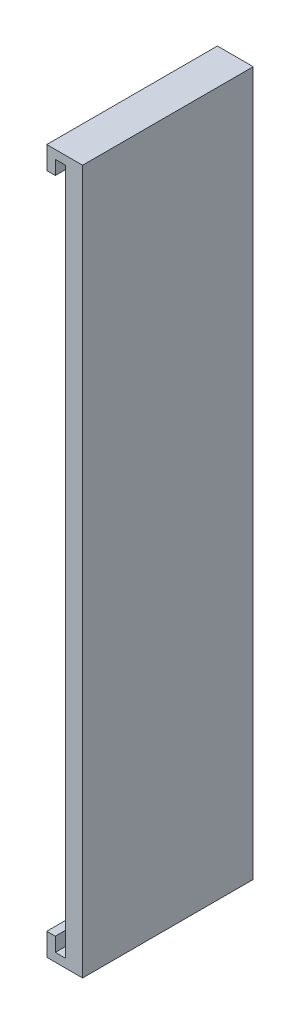
ISO-10303-21;
HEADER;
FILE_DESCRIPTION(('STEP AP214'),'2;1');
FILE_NAME('part.step','',(''),(''),'','','');
FILE_SCHEMA(('AUTOMOTIVE_DESIGN { 1 0 10303 214 1 1 1 1 }'));
ENDSEC;
DATA;
#1=APPLICATION_CONTEXT('core data for automotive mechanical design processes');
#2=APPLICATION_PROTOCOL_DEFINITION('international standard','automotive_design',2000,#1);
#3=PRODUCT_CONTEXT('',#1,'mechanical');
#4=PRODUCT('Part','Part','',(#3));
#5=PRODUCT_RELATED_PRODUCT_CATEGORY('part','',(#4));
#6=PRODUCT_DEFINITION_FORMATION('','',#4);
#7=PRODUCT_DEFINITION_CONTEXT('part definition',#1,'design');
#8=PRODUCT_DEFINITION('design','',#6,#7);
#9=PRODUCT_DEFINITION_SHAPE('','',#8);
#10=(LENGTH_UNIT() NAMED_UNIT(*) SI_UNIT(.MILLI.,.METRE.));
#11=(NAMED_UNIT(*) PLANE_ANGLE_UNIT() SI_UNIT($,.RADIAN.));
#12=(NAMED_UNIT(*) SI_UNIT($,.STERADIAN.) SOLID_ANGLE_UNIT());
#13=UNCERTAINTY_MEASURE_WITH_UNIT(LENGTH_MEASURE(1.E-05),#10,'distance_accuracy_value','');
#14=(GEOMETRIC_REPRESENTATION_CONTEXT(3) GLOBAL_UNCERTAINTY_ASSIGNED_CONTEXT((#13)) GLOBAL_UNIT_ASSIGNED_CONTEXT((#10,
#11,#12)) REPRESENTATION_CONTEXT('',''));
#15=CARTESIAN_POINT('',(0.,0.,0.));
#16=DIRECTION('',(0.,0.,1.));
#17=DIRECTION('',(1.,0.,0.));
#18=AXIS2_PLACEMENT_3D('',#15,#16,#17);
#19=CARTESIAN_POINT('',(2.67865421041862E-13,38.6034755324663,20.));
#20=DIRECTION('',(0.,1.,0.));
#21=DIRECTION('',(-1.,0.,0.));
#22=AXIS2_PLACEMENT_3D('',#19,#20,#21);
#23=PLANE('',#22);
#24=DIRECTION('',(1.,0.,0.));
#25=VECTOR('',#24,1.);
#26=CARTESIAN_POINT('',(2.67865421041862E-13,38.6034755324663,0.));
#27=LINE('',#26,#25);
#28=CARTESIAN_POINT('',(-1.6,38.6034755324663,0.));
#29=VERTEX_POINT('',#28);
#30=CARTESIAN_POINT('',(-0.6,38.6034755324663,0.));
#31=VERTEX_POINT('',#30);
#32=EDGE_CURVE('E173',#29,#31,#27,.T.);
#33=ORIENTED_EDGE('',*,*,#32,.T.);
#34=DIRECTION('',(0.,0.,-1.));
#35=VECTOR('',#34,1.);
#36=CARTESIAN_POINT('',(-0.6,38.6034755324663,20.));
#37=LINE('',#36,#35);
#38=CARTESIAN_POINT('',(-0.6,38.6034755324663,20.));
#39=VERTEX_POINT('',#38);
#40=EDGE_CURVE('E11',#39,#31,#37,.T.);
#41=ORIENTED_EDGE('',*,*,#40,.F.);
#42=DIRECTION('',(1.,0.,0.));
#43=VECTOR('',#42,1.);
#44=CARTESIAN_POINT('',(2.67865421041862E-13,38.6034755324663,20.));
#45=LINE('',#44,#43);
#46=CARTESIAN_POINT('',(-1.6,38.6034755324663,20.));
#47=VERTEX_POINT('',#46);
#48=EDGE_CURVE('E216',#47,#39,#45,.T.);
#49=ORIENTED_EDGE('',*,*,#48,.F.);
#50=DIRECTION('',(0.,0.,-1.));
#51=VECTOR('',#50,1.);
#52=CARTESIAN_POINT('',(-1.6,38.6034755324663,20.));
#53=LINE('',#52,#51);
#54=EDGE_CURVE('E62',#47,#29,#53,.T.);
#55=ORIENTED_EDGE('',*,*,#54,.T.);
#56=EDGE_LOOP('',(#33,#41,#49,#55));
#57=FACE_BOUND('',#56,.T.);
#58=ADVANCED_FACE('F45',(#57),#23,.F.);
#59=CARTESIAN_POINT('',(-0.599999999999997,0.,20.));
#60=DIRECTION('',(-1.,0.,0.));
#61=DIRECTION('',(0.,-1.,0.));
#62=AXIS2_PLACEMENT_3D('',#59,#60,#61);
#63=PLANE('',#62);
#64=DIRECTION('',(0.,1.,0.));
#65=VECTOR('',#64,1.);
#66=CARTESIAN_POINT('',(-0.599999999999997,0.,0.));
#67=LINE('',#66,#65);
#68=CARTESIAN_POINT('',(-0.6,40.25,0.));
#69=VERTEX_POINT('',#68);
#70=EDGE_CURVE('E176',#31,#69,#67,.T.);
#71=ORIENTED_EDGE('',*,*,#70,.T.);
#72=DIRECTION('',(0.,0.,-1.));
#73=VECTOR('',#72,1.);
#74=CARTESIAN_POINT('',(-0.6,40.25,20.));
#75=LINE('',#74,#73);
#76=CARTESIAN_POINT('',(-0.6,40.25,20.));
#77=VERTEX_POINT('',#76);
#78=EDGE_CURVE('E54',#77,#69,#75,.T.);
#79=ORIENTED_EDGE('',*,*,#78,.F.);
#80=DIRECTION('',(0.,1.,0.));
#81=VECTOR('',#80,1.);
#82=CARTESIAN_POINT('',(-0.599999999999997,0.,20.));
#83=LINE('',#82,#81);
#84=EDGE_CURVE('E113',#39,#77,#83,.T.);
#85=ORIENTED_EDGE('',*,*,#84,.F.);
#86=ORIENTED_EDGE('',*,*,#40,.T.);
#87=EDGE_LOOP('',(#71,#79,#85,#86));
#88=FACE_BOUND('',#87,.T.);
#89=ADVANCED_FACE('F247',(#88),#63,.F.);
#90=CARTESIAN_POINT('',(0.,40.25,20.));
#91=DIRECTION('',(0.,-1.,0.));
#92=DIRECTION('',(0.,0.,-1.));
#93=AXIS2_PLACEMENT_3D('',#90,#91,#92);
#94=PLANE('',#93);
#95=DIRECTION('',(-1.,0.,0.));
#96=VECTOR('',#95,1.);
#97=CARTESIAN_POINT('',(0.,40.25,0.));
#98=LINE('',#97,#96);
#99=CARTESIAN_POINT('',(0.6,40.25,0.));
#100=VERTEX_POINT('',#99);
#101=EDGE_CURVE('E180',#100,#69,#98,.T.);
#102=ORIENTED_EDGE('',*,*,#101,.F.);
#103=DIRECTION('',(0.,0.,-1.));
#104=VECTOR('',#103,1.);
#105=CARTESIAN_POINT('',(0.6,40.25,20.));
#106=LINE('',#105,#104);
#107=CARTESIAN_POINT('',(0.6,40.25,20.));
#108=VERTEX_POINT('',#107);
#109=EDGE_CURVE('E237',#108,#100,#106,.T.);
#110=ORIENTED_EDGE('',*,*,#109,.F.);
#111=DIRECTION('',(-1.,0.,0.));
#112=VECTOR('',#111,1.);
#113=CARTESIAN_POINT('',(0.,40.25,20.));
#114=LINE('',#113,#112);
#115=EDGE_CURVE('E246',#108,#77,#114,.T.);
#116=ORIENTED_EDGE('',*,*,#115,.T.);
#117=ORIENTED_EDGE('',*,*,#78,.T.);
#118=EDGE_LOOP('',(#102,#110,#116,#117));
#119=FACE_BOUND('',#118,.T.);
#120=ADVANCED_FACE('F244',(#119),#94,.T.);
#121=CARTESIAN_POINT('',(0.6,0.,20.));
#122=DIRECTION('',(-1.,0.,0.));
#123=DIRECTION('',(0.,0.,1.));
#124=AXIS2_PLACEMENT_3D('',#121,#122,#123);
#125=PLANE('',#124);
#126=DIRECTION('',(0.,1.,0.));
#127=VECTOR('',#126,1.);
#128=CARTESIAN_POINT('',(0.6,0.,0.));
#129=LINE('',#128,#127);
#130=CARTESIAN_POINT('',(0.6,-40.25,0.));
#131=VERTEX_POINT('',#130);
#132=EDGE_CURVE('E184',#131,#100,#129,.T.);
#133=ORIENTED_EDGE('',*,*,#132,.F.);
#134=DIRECTION('',(0.,0.,-1.));
#135=VECTOR('',#134,1.);
#136=CARTESIAN_POINT('',(0.6,-40.25,20.));
#137=LINE('',#136,#135);
#138=CARTESIAN_POINT('',(0.6,-40.25,20.));
#139=VERTEX_POINT('',#138);
#140=EDGE_CURVE('E235',#139,#131,#137,.T.);
#141=ORIENTED_EDGE('',*,*,#140,.F.);
#142=DIRECTION('',(0.,1.,0.));
#143=VECTOR('',#142,1.);
#144=CARTESIAN_POINT('',(0.6,0.,20.));
#145=LINE('',#144,#143);
#146=EDGE_CURVE('E259',#139,#108,#145,.T.);
#147=ORIENTED_EDGE('',*,*,#146,.T.);
#148=ORIENTED_EDGE('',*,*,#109,.T.);
#149=EDGE_LOOP('',(#133,#141,#147,#148));
#150=FACE_BOUND('',#149,.T.);
#151=ADVANCED_FACE('F255',(#150),#125,.T.);
#152=CARTESIAN_POINT('',(0.,-40.25,20.));
#153=DIRECTION('',(0.,-1.,0.));
#154=DIRECTION('',(0.,0.,-1.));
#155=AXIS2_PLACEMENT_3D('',#152,#153,#154);
#156=PLANE('',#155);
#157=DIRECTION('',(-1.,0.,0.));
#158=VECTOR('',#157,1.);
#159=CARTESIAN_POINT('',(0.,-40.25,0.));
#160=LINE('',#159,#158);
#161=CARTESIAN_POINT('',(-0.6,-40.25,0.));
#162=VERTEX_POINT('',#161);
#163=EDGE_CURVE('E188',#131,#162,#160,.T.);
#164=ORIENTED_EDGE('',*,*,#163,.T.);
#165=DIRECTION('',(0.,0.,-1.));
#166=VECTOR('',#165,1.);
#167=CARTESIAN_POINT('',(-0.6,-40.25,20.));
#168=LINE('',#167,#166);
#169=CARTESIAN_POINT('',(-0.6,-40.25,20.));
#170=VERTEX_POINT('',#169);
#171=EDGE_CURVE('E231',#170,#162,#168,.T.);
#172=ORIENTED_EDGE('',*,*,#171,.F.);
#173=DIRECTION('',(-1.,0.,0.));
#174=VECTOR('',#173,1.);
#175=CARTESIAN_POINT('',(0.,-40.25,20.));
#176=LINE('',#175,#174);
#177=EDGE_CURVE('E263',#139,#170,#176,.T.);
#178=ORIENTED_EDGE('',*,*,#177,.F.);
#179=ORIENTED_EDGE('',*,*,#140,.T.);
#180=EDGE_LOOP('',(#164,#172,#178,#179));
#181=FACE_BOUND('',#180,.T.);
#182=ADVANCED_FACE('F304',(#181),#156,.F.);
#183=CARTESIAN_POINT('',(-0.600000000000003,0.,20.));
#184=DIRECTION('',(-1.,0.,0.));
#185=DIRECTION('',(0.,-1.,0.));
#186=AXIS2_PLACEMENT_3D('',#183,#184,#185);
#187=PLANE('',#186);
#188=DIRECTION('',(0.,1.,0.));
#189=VECTOR('',#188,1.);
#190=CARTESIAN_POINT('',(-0.600000000000003,0.,0.));
#191=LINE('',#190,#189);
#192=CARTESIAN_POINT('',(-0.6,-38.6034755324663,0.));
#193=VERTEX_POINT('',#192);
#194=EDGE_CURVE('E191',#162,#193,#191,.T.);
#195=ORIENTED_EDGE('',*,*,#194,.T.);
#196=DIRECTION('',(0.,0.,-1.));
#197=VECTOR('',#196,1.);
#198=CARTESIAN_POINT('',(-0.6,-38.6034755324663,20.));
#199=LINE('',#198,#197);
#200=CARTESIAN_POINT('',(-0.6,-38.6034755324663,20.));
#201=VERTEX_POINT('',#200);
#202=EDGE_CURVE('E228',#201,#193,#199,.T.);
#203=ORIENTED_EDGE('',*,*,#202,.F.);
#204=DIRECTION('',(0.,1.,0.));
#205=VECTOR('',#204,1.);
#206=CARTESIAN_POINT('',(-0.600000000000003,0.,20.));
#207=LINE('',#206,#205);
#208=EDGE_CURVE('E271',#170,#201,#207,.T.);
#209=ORIENTED_EDGE('',*,*,#208,.F.);
#210=ORIENTED_EDGE('',*,*,#171,.T.);
#211=EDGE_LOOP('',(#195,#203,#209,#210));
#212=FACE_BOUND('',#211,.T.);
#213=ADVANCED_FACE('F307',(#212),#187,.F.);
#214=CARTESIAN_POINT('',(0.,-38.6034755324663,20.));
#215=DIRECTION('',(0.,1.,0.));
#216=DIRECTION('',(0.,0.,1.));
#217=AXIS2_PLACEMENT_3D('',#214,#215,#216);
#218=PLANE('',#217);
#219=DIRECTION('',(1.,0.,0.));
#220=VECTOR('',#219,1.);
#221=CARTESIAN_POINT('',(0.,-38.6034755324663,0.));
#222=LINE('',#221,#220);
#223=CARTESIAN_POINT('',(-1.6,-38.6034755324663,0.));
#224=VERTEX_POINT('',#223);
#225=EDGE_CURVE('E195',#224,#193,#222,.T.);
#226=ORIENTED_EDGE('',*,*,#225,.F.);
#227=DIRECTION('',(0.,0.,-1.));
#228=VECTOR('',#227,1.);
#229=CARTESIAN_POINT('',(-1.6,-38.6034755324663,20.));
#230=LINE('',#229,#228);
#231=CARTESIAN_POINT('',(-1.6,-38.6034755324663,20.));
#232=VERTEX_POINT('',#231);
#233=EDGE_CURVE('E225',#232,#224,#230,.T.);
#234=ORIENTED_EDGE('',*,*,#233,.F.);
#235=DIRECTION('',(1.,0.,0.));
#236=VECTOR('',#235,1.);
#237=CARTESIAN_POINT('',(0.,-38.6034755324663,20.));
#238=LINE('',#237,#236);
#239=EDGE_CURVE('E274',#232,#201,#238,.T.);
#240=ORIENTED_EDGE('',*,*,#239,.T.);
#241=ORIENTED_EDGE('',*,*,#202,.T.);
#242=EDGE_LOOP('',(#226,#234,#240,#241));
#243=FACE_BOUND('',#242,.T.);
#244=ADVANCED_FACE('F311',(#243),#218,.T.);
#245=CARTESIAN_POINT('',(-1.6,0.,20.));
#246=DIRECTION('',(-1.,0.,0.));
#247=DIRECTION('',(0.,-1.,0.));
#248=AXIS2_PLACEMENT_3D('',#245,#246,#247);
#249=PLANE('',#248);
#250=DIRECTION('',(0.,1.,0.));
#251=VECTOR('',#250,1.);
#252=CARTESIAN_POINT('',(-1.6,0.,0.));
#253=LINE('',#252,#251);
#254=CARTESIAN_POINT('',(-1.6,-41.25,0.));
#255=VERTEX_POINT('',#254);
#256=EDGE_CURVE('E199',#255,#224,#253,.T.);
#257=ORIENTED_EDGE('',*,*,#256,.F.);
#258=DIRECTION('',(0.,0.,-1.));
#259=VECTOR('',#258,1.);
#260=CARTESIAN_POINT('',(-1.6,-41.25,20.));
#261=LINE('',#260,#259);
#262=CARTESIAN_POINT('',(-1.6,-41.25,20.));
#263=VERTEX_POINT('',#262);
#264=EDGE_CURVE('E222',#263,#255,#261,.T.);
#265=ORIENTED_EDGE('',*,*,#264,.F.);
#266=DIRECTION('',(0.,1.,0.));
#267=VECTOR('',#266,1.);
#268=CARTESIAN_POINT('',(-1.6,0.,20.));
#269=LINE('',#268,#267);
#270=EDGE_CURVE('E277',#263,#232,#269,.T.);
#271=ORIENTED_EDGE('',*,*,#270,.T.);
#272=ORIENTED_EDGE('',*,*,#233,.T.);
#273=EDGE_LOOP('',(#257,#265,#271,#272));
#274=FACE_BOUND('',#273,.T.);
#275=ADVANCED_FACE('F315',(#274),#249,.T.);
#276=CARTESIAN_POINT('',(0.,-41.25,20.));
#277=DIRECTION('',(0.,-1.,0.));
#278=DIRECTION('',(0.,0.,-1.));
#279=AXIS2_PLACEMENT_3D('',#276,#277,#278);
#280=PLANE('',#279);
#281=DIRECTION('',(-1.,0.,0.));
#282=VECTOR('',#281,1.);
#283=CARTESIAN_POINT('',(0.,-41.25,0.));
#284=LINE('',#283,#282);
#285=CARTESIAN_POINT('',(2.6,-41.25,0.));
#286=VERTEX_POINT('',#285);
#287=EDGE_CURVE('E203',#286,#255,#284,.T.);
#288=ORIENTED_EDGE('',*,*,#287,.F.);
#289=DIRECTION('',(0.,0.,-1.));
#290=VECTOR('',#289,1.);
#291=CARTESIAN_POINT('',(2.6,-41.25,20.));
#292=LINE('',#291,#290);
#293=CARTESIAN_POINT('',(2.6,-41.25,20.));
#294=VERTEX_POINT('',#293);
#295=EDGE_CURVE('E161',#294,#286,#292,.T.);
#296=ORIENTED_EDGE('',*,*,#295,.F.);
#297=DIRECTION('',(-1.,0.,0.));
#298=VECTOR('',#297,1.);
#299=CARTESIAN_POINT('',(0.,-41.25,20.));
#300=LINE('',#299,#298);
#301=EDGE_CURVE('E149',#294,#263,#300,.T.);
#302=ORIENTED_EDGE('',*,*,#301,.T.);
#303=ORIENTED_EDGE('',*,*,#264,.T.);
#304=EDGE_LOOP('',(#288,#296,#302,#303));
#305=FACE_BOUND('',#304,.T.);
#306=ADVANCED_FACE('F283',(#305),#280,.T.);
#307=CARTESIAN_POINT('',(2.6,0.,20.));
#308=DIRECTION('',(-1.,0.,0.));
#309=DIRECTION('',(0.,0.,1.));
#310=AXIS2_PLACEMENT_3D('',#307,#308,#309);
#311=PLANE('',#310);
#312=DIRECTION('',(0.,1.,0.));
#313=VECTOR('',#312,1.);
#314=CARTESIAN_POINT('',(2.6,0.,0.));
#315=LINE('',#314,#313);
#316=CARTESIAN_POINT('',(2.6,41.25,0.));
#317=VERTEX_POINT('',#316);
#318=EDGE_CURVE('E157',#286,#317,#315,.T.);
#319=ORIENTED_EDGE('',*,*,#318,.T.);
#320=DIRECTION('',(0.,0.,-1.));
#321=VECTOR('',#320,1.);
#322=CARTESIAN_POINT('',(2.6,41.25,20.));
#323=LINE('',#322,#321);
#324=CARTESIAN_POINT('',(2.6,41.25,20.));
#325=VERTEX_POINT('',#324);
#326=EDGE_CURVE('E154',#325,#317,#323,.T.);
#327=ORIENTED_EDGE('',*,*,#326,.F.);
#328=DIRECTION('',(0.,1.,0.));
#329=VECTOR('',#328,1.);
#330=CARTESIAN_POINT('',(2.6,0.,20.));
#331=LINE('',#330,#329);
#332=EDGE_CURVE('E141',#294,#325,#331,.T.);
#333=ORIENTED_EDGE('',*,*,#332,.F.);
#334=ORIENTED_EDGE('',*,*,#295,.T.);
#335=EDGE_LOOP('',(#319,#327,#333,#334));
#336=FACE_BOUND('',#335,.T.);
#337=ADVANCED_FACE('F155',(#336),#311,.F.);
#338=CARTESIAN_POINT('',(0.,41.25,20.));
#339=DIRECTION('',(0.,-1.,0.));
#340=DIRECTION('',(0.,0.,-1.));
#341=AXIS2_PLACEMENT_3D('',#338,#339,#340);
#342=PLANE('',#341);
#343=DIRECTION('',(-1.,0.,0.));
#344=VECTOR('',#343,1.);
#345=CARTESIAN_POINT('',(0.,41.25,0.));
#346=LINE('',#345,#344);
#347=CARTESIAN_POINT('',(-1.6,41.25,0.));
#348=VERTEX_POINT('',#347);
#349=EDGE_CURVE('E209',#317,#348,#346,.T.);
#350=ORIENTED_EDGE('',*,*,#349,.T.);
#351=DIRECTION('',(0.,0.,-1.));
#352=VECTOR('',#351,1.);
#353=CARTESIAN_POINT('',(-1.6,41.25,20.));
#354=LINE('',#353,#352);
#355=CARTESIAN_POINT('',(-1.6,41.25,20.));
#356=VERTEX_POINT('',#355);
#357=EDGE_CURVE('E101',#356,#348,#354,.T.);
#358=ORIENTED_EDGE('',*,*,#357,.F.);
#359=DIRECTION('',(-1.,0.,0.));
#360=VECTOR('',#359,1.);
#361=CARTESIAN_POINT('',(0.,41.25,20.));
#362=LINE('',#361,#360);
#363=EDGE_CURVE('E146',#325,#356,#362,.T.);
#364=ORIENTED_EDGE('',*,*,#363,.F.);
#365=ORIENTED_EDGE('',*,*,#326,.T.);
#366=EDGE_LOOP('',(#350,#358,#364,#365));
#367=FACE_BOUND('',#366,.T.);
#368=ADVANCED_FACE('F163',(#367),#342,.F.);
#369=CARTESIAN_POINT('',(-1.60000000000001,0.,20.));
#370=DIRECTION('',(-1.,0.,0.));
#371=DIRECTION('',(0.,-1.,0.));
#372=AXIS2_PLACEMENT_3D('',#369,#370,#371);
#373=PLANE('',#372);
#374=DIRECTION('',(0.,1.,0.));
#375=VECTOR('',#374,1.);
#376=CARTESIAN_POINT('',(-1.60000000000001,0.,0.));
#377=LINE('',#376,#375);
#378=EDGE_CURVE('E212',#29,#348,#377,.T.);
#379=ORIENTED_EDGE('',*,*,#378,.F.);
#380=ORIENTED_EDGE('',*,*,#54,.F.);
#381=DIRECTION('',(0.,1.,0.));
#382=VECTOR('',#381,1.);
#383=CARTESIAN_POINT('',(-1.60000000000001,0.,20.));
#384=LINE('',#383,#382);
#385=EDGE_CURVE('E165',#47,#356,#384,.T.);
#386=ORIENTED_EDGE('',*,*,#385,.T.);
#387=ORIENTED_EDGE('',*,*,#357,.T.);
#388=EDGE_LOOP('',(#379,#380,#386,#387));
#389=FACE_BOUND('',#388,.T.);
#390=ADVANCED_FACE('F285',(#389),#373,.T.);
#391=CARTESIAN_POINT('',(0.,0.,20.));
#392=DIRECTION('',(0.,0.,1.));
#393=DIRECTION('',(1.,0.,0.));
#394=AXIS2_PLACEMENT_3D('',#391,#392,#393);
#395=PLANE('',#394);
#396=ORIENTED_EDGE('',*,*,#48,.T.);
#397=ORIENTED_EDGE('',*,*,#84,.T.);
#398=ORIENTED_EDGE('',*,*,#115,.F.);
#399=ORIENTED_EDGE('',*,*,#146,.F.);
#400=ORIENTED_EDGE('',*,*,#177,.T.);
#401=ORIENTED_EDGE('',*,*,#208,.T.);
#402=ORIENTED_EDGE('',*,*,#239,.F.);
#403=ORIENTED_EDGE('',*,*,#270,.F.);
#404=ORIENTED_EDGE('',*,*,#301,.F.);
#405=ORIENTED_EDGE('',*,*,#332,.T.);
#406=ORIENTED_EDGE('',*,*,#363,.T.);
#407=ORIENTED_EDGE('',*,*,#385,.F.);
#408=EDGE_LOOP('',(#396,#397,#398,#399,#400,#401,#402,#403,#404,#405,#406,#407));
#409=FACE_BOUND('',#408,.T.);
#410=ADVANCED_FACE('F143',(#409),#395,.T.);
#411=CARTESIAN_POINT('',(0.,0.,0.));
#412=DIRECTION('',(0.,0.,1.));
#413=DIRECTION('',(1.,0.,0.));
#414=AXIS2_PLACEMENT_3D('',#411,#412,#413);
#415=PLANE('',#414);
#416=ORIENTED_EDGE('',*,*,#32,.F.);
#417=ORIENTED_EDGE('',*,*,#378,.T.);
#418=ORIENTED_EDGE('',*,*,#349,.F.);
#419=ORIENTED_EDGE('',*,*,#318,.F.);
#420=ORIENTED_EDGE('',*,*,#287,.T.);
#421=ORIENTED_EDGE('',*,*,#256,.T.);
#422=ORIENTED_EDGE('',*,*,#225,.T.);
#423=ORIENTED_EDGE('',*,*,#194,.F.);
#424=ORIENTED_EDGE('',*,*,#163,.F.);
#425=ORIENTED_EDGE('',*,*,#132,.T.);
#426=ORIENTED_EDGE('',*,*,#101,.T.);
#427=ORIENTED_EDGE('',*,*,#70,.F.);
#428=EDGE_LOOP('',(#416,#417,#418,#419,#420,#421,#422,#423,#424,#425,#426,#427));
#429=FACE_BOUND('',#428,.T.);
#430=ADVANCED_FACE('F250',(#429),#415,.F.);
#431=CLOSED_SHELL('',(#58,#89,#120,#151,#182,#213,#244,#275,#306,#337,#368,#390,#410,#430));
#432=MANIFOLD_SOLID_BREP('B2',#431);
#433=ADVANCED_BREP_SHAPE_REPRESENTATION('',(#18,#432),#14);
#434=SHAPE_DEFINITION_REPRESENTATION(#9,#433);
ENDSEC;
END-ISO-10303-21;
